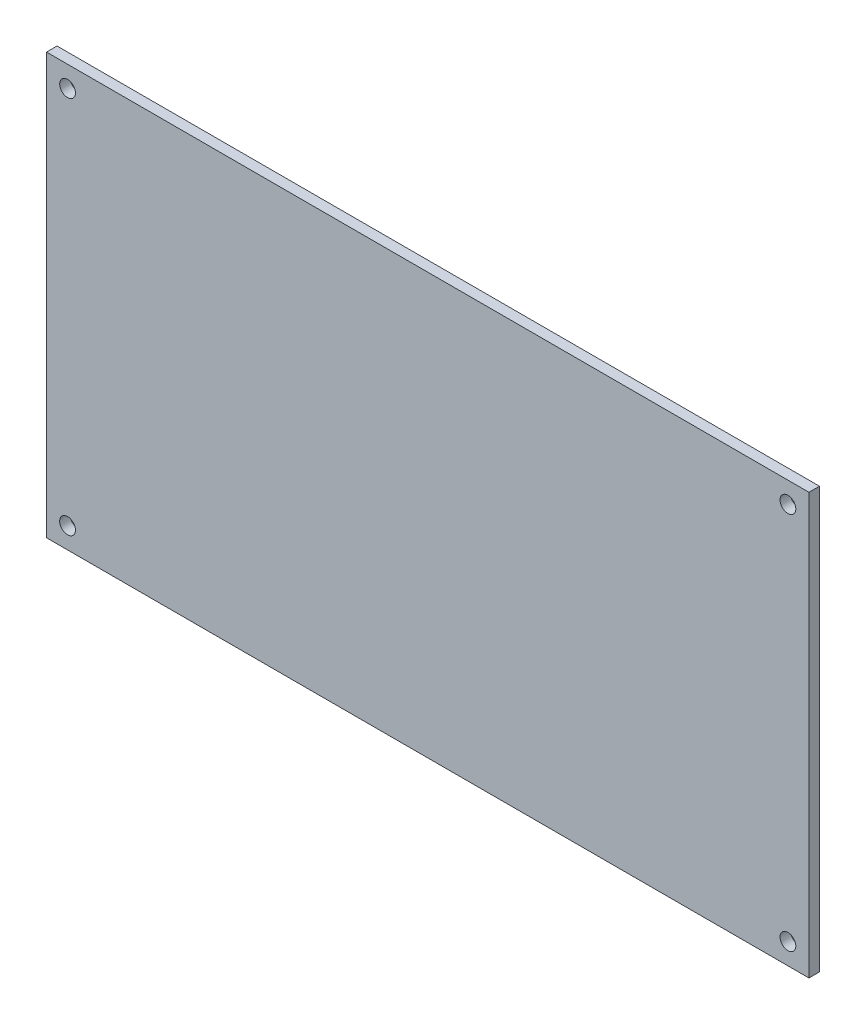
ISO-10303-21;
HEADER;
FILE_DESCRIPTION(('STEP AP214'),'2;1');
FILE_NAME('part.step','',(''),(''),'','','');
FILE_SCHEMA(('AUTOMOTIVE_DESIGN { 1 0 10303 214 1 1 1 1 }'));
ENDSEC;
DATA;
#1=APPLICATION_CONTEXT('core data for automotive mechanical design processes');
#2=APPLICATION_PROTOCOL_DEFINITION('international standard','automotive_design',2000,#1);
#3=PRODUCT_CONTEXT('',#1,'mechanical');
#4=PRODUCT('Part','Part','',(#3));
#5=PRODUCT_RELATED_PRODUCT_CATEGORY('part','',(#4));
#6=PRODUCT_DEFINITION_FORMATION('','',#4);
#7=PRODUCT_DEFINITION_CONTEXT('part definition',#1,'design');
#8=PRODUCT_DEFINITION('design','',#6,#7);
#9=PRODUCT_DEFINITION_SHAPE('','',#8);
#10=(LENGTH_UNIT() NAMED_UNIT(*) SI_UNIT(.MILLI.,.METRE.));
#11=(NAMED_UNIT(*) PLANE_ANGLE_UNIT() SI_UNIT($,.RADIAN.));
#12=(NAMED_UNIT(*) SI_UNIT($,.STERADIAN.) SOLID_ANGLE_UNIT());
#13=UNCERTAINTY_MEASURE_WITH_UNIT(LENGTH_MEASURE(1.E-05),#10,'distance_accuracy_value','');
#14=(GEOMETRIC_REPRESENTATION_CONTEXT(3) GLOBAL_UNCERTAINTY_ASSIGNED_CONTEXT((#13)) GLOBAL_UNIT_ASSIGNED_CONTEXT((#10,
#11,#12)) REPRESENTATION_CONTEXT('',''));
#15=CARTESIAN_POINT('',(0.,0.,0.));
#16=DIRECTION('',(0.,0.,1.));
#17=DIRECTION('',(1.,0.,0.));
#18=AXIS2_PLACEMENT_3D('',#15,#16,#17);
#19=CARTESIAN_POINT('',(141.,4.,0.));
#20=DIRECTION('',(0.,0.,1.));
#21=DIRECTION('',(1.,0.,0.));
#22=AXIS2_PLACEMENT_3D('',#19,#20,#21);
#23=CYLINDRICAL_SURFACE('',#22,1.5);
#24=CARTESIAN_POINT('',(141.,4.,0.));
#25=DIRECTION('',(0.,0.,1.));
#26=DIRECTION('',(1.,0.,0.));
#27=AXIS2_PLACEMENT_3D('',#24,#25,#26);
#28=CIRCLE('',#27,1.5);
#29=CARTESIAN_POINT('',(142.5,4.,0.));
#30=VERTEX_POINT('',#29);
#31=EDGE_CURVE('E48',#30,#30,#28,.T.);
#32=ORIENTED_EDGE('',*,*,#31,.F.);
#33=EDGE_LOOP('',(#32));
#34=FACE_BOUND('',#33,.T.);
#35=CARTESIAN_POINT('',(141.,4.,2.));
#36=DIRECTION('',(0.,0.,1.));
#37=DIRECTION('',(1.,0.,0.));
#38=AXIS2_PLACEMENT_3D('',#35,#36,#37);
#39=CIRCLE('',#38,1.5);
#40=CARTESIAN_POINT('',(142.5,4.,2.));
#41=VERTEX_POINT('',#40);
#42=EDGE_CURVE('E11',#41,#41,#39,.T.);
#43=ORIENTED_EDGE('',*,*,#42,.T.);
#44=EDGE_LOOP('',(#43));
#45=FACE_BOUND('',#44,.T.);
#46=ADVANCED_FACE('F39',(#34,#45),#23,.F.);
#47=CARTESIAN_POINT('',(4.,4.,0.));
#48=DIRECTION('',(0.,0.,1.));
#49=DIRECTION('',(1.,0.,0.));
#50=AXIS2_PLACEMENT_3D('',#47,#48,#49);
#51=CYLINDRICAL_SURFACE('',#50,1.5);
#52=CARTESIAN_POINT('',(4.,4.,0.));
#53=DIRECTION('',(0.,0.,1.));
#54=DIRECTION('',(1.,0.,0.));
#55=AXIS2_PLACEMENT_3D('',#52,#53,#54);
#56=CIRCLE('',#55,1.5);
#57=CARTESIAN_POINT('',(5.5,4.,0.));
#58=VERTEX_POINT('',#57);
#59=EDGE_CURVE('E129',#58,#58,#56,.T.);
#60=ORIENTED_EDGE('',*,*,#59,.F.);
#61=EDGE_LOOP('',(#60));
#62=FACE_BOUND('',#61,.T.);
#63=CARTESIAN_POINT('',(4.,4.,2.));
#64=DIRECTION('',(0.,0.,1.));
#65=DIRECTION('',(1.,0.,0.));
#66=AXIS2_PLACEMENT_3D('',#63,#64,#65);
#67=CIRCLE('',#66,1.5);
#68=CARTESIAN_POINT('',(5.5,4.,2.));
#69=VERTEX_POINT('',#68);
#70=EDGE_CURVE('E133',#69,#69,#67,.T.);
#71=ORIENTED_EDGE('',*,*,#70,.T.);
#72=EDGE_LOOP('',(#71));
#73=FACE_BOUND('',#72,.T.);
#74=ADVANCED_FACE('F144',(#62,#73),#51,.F.);
#75=CARTESIAN_POINT('',(0.,80.,2.));
#76=DIRECTION('',(1.,0.,0.));
#77=DIRECTION('',(0.,0.,-1.));
#78=AXIS2_PLACEMENT_3D('',#75,#76,#77);
#79=PLANE('',#78);
#80=DIRECTION('',(0.,-1.,0.));
#81=VECTOR('',#80,1.);
#82=CARTESIAN_POINT('',(0.,80.,0.));
#83=LINE('',#82,#81);
#84=CARTESIAN_POINT('',(0.,80.,0.));
#85=VERTEX_POINT('',#84);
#86=CARTESIAN_POINT('',(0.,0.,0.));
#87=VERTEX_POINT('',#86);
#88=EDGE_CURVE('E112',#85,#87,#83,.T.);
#89=ORIENTED_EDGE('',*,*,#88,.T.);
#90=DIRECTION('',(0.,0.,-1.));
#91=VECTOR('',#90,1.);
#92=CARTESIAN_POINT('',(0.,0.,2.));
#93=LINE('',#92,#91);
#94=CARTESIAN_POINT('',(0.,0.,2.));
#95=VERTEX_POINT('',#94);
#96=EDGE_CURVE('E101',#95,#87,#93,.T.);
#97=ORIENTED_EDGE('',*,*,#96,.F.);
#98=DIRECTION('',(0.,-1.,0.));
#99=VECTOR('',#98,1.);
#100=CARTESIAN_POINT('',(0.,80.,2.));
#101=LINE('',#100,#99);
#102=CARTESIAN_POINT('',(0.,80.,2.));
#103=VERTEX_POINT('',#102);
#104=EDGE_CURVE('E93',#103,#95,#101,.T.);
#105=ORIENTED_EDGE('',*,*,#104,.F.);
#106=DIRECTION('',(0.,0.,-1.));
#107=VECTOR('',#106,1.);
#108=CARTESIAN_POINT('',(0.,80.,2.));
#109=LINE('',#108,#107);
#110=EDGE_CURVE('E108',#103,#85,#109,.T.);
#111=ORIENTED_EDGE('',*,*,#110,.T.);
#112=EDGE_LOOP('',(#89,#97,#105,#111));
#113=FACE_BOUND('',#112,.T.);
#114=ADVANCED_FACE('F168',(#113),#79,.F.);
#115=CARTESIAN_POINT('',(0.,0.,2.));
#116=DIRECTION('',(0.,1.,0.));
#117=DIRECTION('',(0.,0.,1.));
#118=AXIS2_PLACEMENT_3D('',#115,#116,#117);
#119=PLANE('',#118);
#120=DIRECTION('',(1.,0.,0.));
#121=VECTOR('',#120,1.);
#122=CARTESIAN_POINT('',(0.,0.,0.));
#123=LINE('',#122,#121);
#124=CARTESIAN_POINT('',(145.,0.,0.));
#125=VERTEX_POINT('',#124);
#126=EDGE_CURVE('E99',#87,#125,#123,.T.);
#127=ORIENTED_EDGE('',*,*,#126,.T.);
#128=DIRECTION('',(0.,0.,-1.));
#129=VECTOR('',#128,1.);
#130=CARTESIAN_POINT('',(145.,0.,2.));
#131=LINE('',#130,#129);
#132=CARTESIAN_POINT('',(145.,0.,2.));
#133=VERTEX_POINT('',#132);
#134=EDGE_CURVE('E97',#133,#125,#131,.T.);
#135=ORIENTED_EDGE('',*,*,#134,.F.);
#136=DIRECTION('',(1.,0.,0.));
#137=VECTOR('',#136,1.);
#138=CARTESIAN_POINT('',(0.,0.,2.));
#139=LINE('',#138,#137);
#140=EDGE_CURVE('E87',#95,#133,#139,.T.);
#141=ORIENTED_EDGE('',*,*,#140,.F.);
#142=ORIENTED_EDGE('',*,*,#96,.T.);
#143=EDGE_LOOP('',(#127,#135,#141,#142));
#144=FACE_BOUND('',#143,.T.);
#145=ADVANCED_FACE('F98',(#144),#119,.F.);
#146=CARTESIAN_POINT('',(145.,80.,2.));
#147=DIRECTION('',(-1.,0.,0.));
#148=DIRECTION('',(0.,0.,1.));
#149=AXIS2_PLACEMENT_3D('',#146,#147,#148);
#150=PLANE('',#149);
#151=DIRECTION('',(0.,1.,0.));
#152=VECTOR('',#151,1.);
#153=CARTESIAN_POINT('',(145.,80.,0.));
#154=LINE('',#153,#152);
#155=CARTESIAN_POINT('',(145.,80.,0.));
#156=VERTEX_POINT('',#155);
#157=EDGE_CURVE('E73',#125,#156,#154,.T.);
#158=ORIENTED_EDGE('',*,*,#157,.T.);
#159=DIRECTION('',(0.,0.,-1.));
#160=VECTOR('',#159,1.);
#161=CARTESIAN_POINT('',(145.,80.,2.));
#162=LINE('',#161,#160);
#163=CARTESIAN_POINT('',(145.,80.,2.));
#164=VERTEX_POINT('',#163);
#165=EDGE_CURVE('E102',#164,#156,#162,.T.);
#166=ORIENTED_EDGE('',*,*,#165,.F.);
#167=DIRECTION('',(0.,1.,0.));
#168=VECTOR('',#167,1.);
#169=CARTESIAN_POINT('',(145.,80.,2.));
#170=LINE('',#169,#168);
#171=EDGE_CURVE('E91',#133,#164,#170,.T.);
#172=ORIENTED_EDGE('',*,*,#171,.F.);
#173=ORIENTED_EDGE('',*,*,#134,.T.);
#174=EDGE_LOOP('',(#158,#166,#172,#173));
#175=FACE_BOUND('',#174,.T.);
#176=ADVANCED_FACE('F104',(#175),#150,.F.);
#177=CARTESIAN_POINT('',(0.,80.,2.));
#178=DIRECTION('',(0.,-1.,0.));
#179=DIRECTION('',(0.,0.,-1.));
#180=AXIS2_PLACEMENT_3D('',#177,#178,#179);
#181=PLANE('',#180);
#182=DIRECTION('',(-1.,0.,0.));
#183=VECTOR('',#182,1.);
#184=CARTESIAN_POINT('',(0.,80.,0.));
#185=LINE('',#184,#183);
#186=EDGE_CURVE('E79',#156,#85,#185,.T.);
#187=ORIENTED_EDGE('',*,*,#186,.T.);
#188=ORIENTED_EDGE('',*,*,#110,.F.);
#189=DIRECTION('',(-1.,0.,0.));
#190=VECTOR('',#189,1.);
#191=CARTESIAN_POINT('',(0.,80.,2.));
#192=LINE('',#191,#190);
#193=EDGE_CURVE('E56',#164,#103,#192,.T.);
#194=ORIENTED_EDGE('',*,*,#193,.F.);
#195=ORIENTED_EDGE('',*,*,#165,.T.);
#196=EDGE_LOOP('',(#187,#188,#194,#195));
#197=FACE_BOUND('',#196,.T.);
#198=ADVANCED_FACE('F148',(#197),#181,.F.);
#199=CARTESIAN_POINT('',(0.,0.,2.));
#200=DIRECTION('',(0.,0.,1.));
#201=DIRECTION('',(1.,0.,0.));
#202=AXIS2_PLACEMENT_3D('',#199,#200,#201);
#203=PLANE('',#202);
#204=CARTESIAN_POINT('',(141.,76.,2.));
#205=DIRECTION('',(0.,0.,1.));
#206=DIRECTION('',(1.,0.,0.));
#207=AXIS2_PLACEMENT_3D('',#204,#205,#206);
#208=CIRCLE('',#207,1.5);
#209=CARTESIAN_POINT('',(142.5,76.,2.));
#210=VERTEX_POINT('',#209);
#211=EDGE_CURVE('E239',#210,#210,#208,.T.);
#212=ORIENTED_EDGE('',*,*,#211,.F.);
#213=EDGE_LOOP('',(#212));
#214=FACE_BOUND('',#213,.T.);
#215=CARTESIAN_POINT('',(4.,76.,2.));
#216=DIRECTION('',(0.,0.,1.));
#217=DIRECTION('',(1.,0.,0.));
#218=AXIS2_PLACEMENT_3D('',#215,#216,#217);
#219=CIRCLE('',#218,1.5);
#220=CARTESIAN_POINT('',(5.5,76.,2.));
#221=VERTEX_POINT('',#220);
#222=EDGE_CURVE('E241',#221,#221,#219,.T.);
#223=ORIENTED_EDGE('',*,*,#222,.F.);
#224=EDGE_LOOP('',(#223));
#225=FACE_BOUND('',#224,.T.);
#226=ORIENTED_EDGE('',*,*,#104,.T.);
#227=ORIENTED_EDGE('',*,*,#140,.T.);
#228=ORIENTED_EDGE('',*,*,#171,.T.);
#229=ORIENTED_EDGE('',*,*,#193,.T.);
#230=EDGE_LOOP('',(#226,#227,#228,#229));
#231=FACE_BOUND('',#230,.T.);
#232=ORIENTED_EDGE('',*,*,#70,.F.);
#233=EDGE_LOOP('',(#232));
#234=FACE_BOUND('',#233,.T.);
#235=ORIENTED_EDGE('',*,*,#42,.F.);
#236=EDGE_LOOP('',(#235));
#237=FACE_BOUND('',#236,.T.);
#238=ADVANCED_FACE('F88',(#214,#225,#231,#234,#237),#203,.T.);
#239=CARTESIAN_POINT('',(0.,0.,0.));
#240=DIRECTION('',(0.,0.,1.));
#241=DIRECTION('',(1.,0.,0.));
#242=AXIS2_PLACEMENT_3D('',#239,#240,#241);
#243=PLANE('',#242);
#244=CARTESIAN_POINT('',(141.,76.,0.));
#245=DIRECTION('',(0.,0.,1.));
#246=DIRECTION('',(1.,0.,0.));
#247=AXIS2_PLACEMENT_3D('',#244,#245,#246);
#248=CIRCLE('',#247,1.5);
#249=CARTESIAN_POINT('',(142.5,76.,0.));
#250=VERTEX_POINT('',#249);
#251=EDGE_CURVE('E237',#250,#250,#248,.T.);
#252=ORIENTED_EDGE('',*,*,#251,.T.);
#253=EDGE_LOOP('',(#252));
#254=FACE_BOUND('',#253,.T.);
#255=CARTESIAN_POINT('',(4.,76.,0.));
#256=DIRECTION('',(0.,0.,1.));
#257=DIRECTION('',(1.,0.,0.));
#258=AXIS2_PLACEMENT_3D('',#255,#256,#257);
#259=CIRCLE('',#258,1.5);
#260=CARTESIAN_POINT('',(5.5,76.,0.));
#261=VERTEX_POINT('',#260);
#262=EDGE_CURVE('E116',#261,#261,#259,.T.);
#263=ORIENTED_EDGE('',*,*,#262,.T.);
#264=EDGE_LOOP('',(#263));
#265=FACE_BOUND('',#264,.T.);
#266=ORIENTED_EDGE('',*,*,#88,.F.);
#267=ORIENTED_EDGE('',*,*,#186,.F.);
#268=ORIENTED_EDGE('',*,*,#157,.F.);
#269=ORIENTED_EDGE('',*,*,#126,.F.);
#270=EDGE_LOOP('',(#266,#267,#268,#269));
#271=FACE_BOUND('',#270,.T.);
#272=ORIENTED_EDGE('',*,*,#59,.T.);
#273=EDGE_LOOP('',(#272));
#274=FACE_BOUND('',#273,.T.);
#275=ORIENTED_EDGE('',*,*,#31,.T.);
#276=EDGE_LOOP('',(#275));
#277=FACE_BOUND('',#276,.T.);
#278=ADVANCED_FACE('F140',(#254,#265,#271,#274,#277),#243,.F.);
#279=CARTESIAN_POINT('',(4.,76.,0.));
#280=DIRECTION('',(0.,0.,1.));
#281=DIRECTION('',(1.,0.,0.));
#282=AXIS2_PLACEMENT_3D('',#279,#280,#281);
#283=CYLINDRICAL_SURFACE('',#282,1.5);
#284=ORIENTED_EDGE('',*,*,#262,.F.);
#285=EDGE_LOOP('',(#284));
#286=FACE_BOUND('',#285,.T.);
#287=ORIENTED_EDGE('',*,*,#222,.T.);
#288=EDGE_LOOP('',(#287));
#289=FACE_BOUND('',#288,.T.);
#290=ADVANCED_FACE('F155',(#286,#289),#283,.F.);
#291=CARTESIAN_POINT('',(141.,76.,0.));
#292=DIRECTION('',(0.,0.,1.));
#293=DIRECTION('',(1.,0.,0.));
#294=AXIS2_PLACEMENT_3D('',#291,#292,#293);
#295=CYLINDRICAL_SURFACE('',#294,1.5);
#296=ORIENTED_EDGE('',*,*,#251,.F.);
#297=EDGE_LOOP('',(#296));
#298=FACE_BOUND('',#297,.T.);
#299=ORIENTED_EDGE('',*,*,#211,.T.);
#300=EDGE_LOOP('',(#299));
#301=FACE_BOUND('',#300,.T.);
#302=ADVANCED_FACE('F206',(#298,#301),#295,.F.);
#303=CLOSED_SHELL('',(#46,#74,#114,#145,#176,#198,#238,#278,#290,#302));
#304=MANIFOLD_SOLID_BREP('B2',#303);
#305=ADVANCED_BREP_SHAPE_REPRESENTATION('',(#18,#304),#14);
#306=SHAPE_DEFINITION_REPRESENTATION(#9,#305);
ENDSEC;
END-ISO-10303-21;
